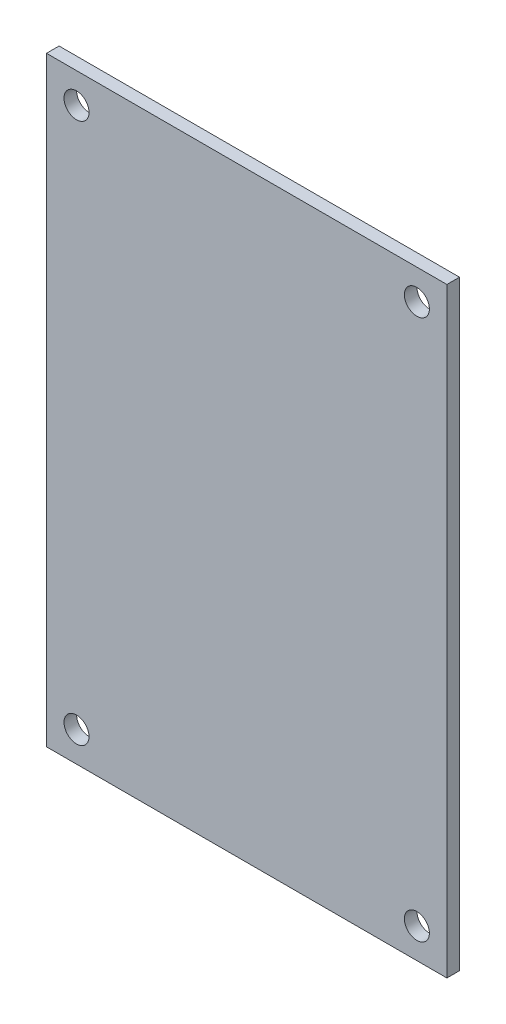
ISO-10303-21;
HEADER;
FILE_DESCRIPTION(('STEP AP214'),'2;1');
FILE_NAME('part.step','',(''),(''),'','','');
FILE_SCHEMA(('AUTOMOTIVE_DESIGN { 1 0 10303 214 1 1 1 1 }'));
ENDSEC;
DATA;
#1=APPLICATION_CONTEXT('core data for automotive mechanical design processes');
#2=APPLICATION_PROTOCOL_DEFINITION('international standard','automotive_design',2000,#1);
#3=PRODUCT_CONTEXT('',#1,'mechanical');
#4=PRODUCT('Part','Part','',(#3));
#5=PRODUCT_RELATED_PRODUCT_CATEGORY('part','',(#4));
#6=PRODUCT_DEFINITION_FORMATION('','',#4);
#7=PRODUCT_DEFINITION_CONTEXT('part definition',#1,'design');
#8=PRODUCT_DEFINITION('design','',#6,#7);
#9=PRODUCT_DEFINITION_SHAPE('','',#8);
#10=(LENGTH_UNIT() NAMED_UNIT(*) SI_UNIT(.MILLI.,.METRE.));
#11=(NAMED_UNIT(*) PLANE_ANGLE_UNIT() SI_UNIT($,.RADIAN.));
#12=(NAMED_UNIT(*) SI_UNIT($,.STERADIAN.) SOLID_ANGLE_UNIT());
#13=UNCERTAINTY_MEASURE_WITH_UNIT(LENGTH_MEASURE(1.E-05),#10,'distance_accuracy_value','');
#14=(GEOMETRIC_REPRESENTATION_CONTEXT(3) GLOBAL_UNCERTAINTY_ASSIGNED_CONTEXT((#13)) GLOBAL_UNIT_ASSIGNED_CONTEXT((#10,
#11,#12)) REPRESENTATION_CONTEXT('',''));
#15=CARTESIAN_POINT('',(0.,0.,0.));
#16=DIRECTION('',(0.,0.,1.));
#17=DIRECTION('',(1.,0.,0.));
#18=AXIS2_PLACEMENT_3D('',#15,#16,#17);
#19=CARTESIAN_POINT('',(-25.4,-38.1,1.6002));
#20=DIRECTION('',(1.,0.,0.));
#21=DIRECTION('',(0.,0.,-1.));
#22=AXIS2_PLACEMENT_3D('',#19,#20,#21);
#23=PLANE('',#22);
#24=DIRECTION('',(0.,-1.,0.));
#25=VECTOR('',#24,1.);
#26=CARTESIAN_POINT('',(-25.4,-38.1,0.));
#27=LINE('',#26,#25);
#28=CARTESIAN_POINT('',(-25.4,38.1,0.));
#29=VERTEX_POINT('',#28);
#30=CARTESIAN_POINT('',(-25.4,-38.1,0.));
#31=VERTEX_POINT('',#30);
#32=EDGE_CURVE('E97',#29,#31,#27,.T.);
#33=ORIENTED_EDGE('',*,*,#32,.T.);
#34=DIRECTION('',(0.,0.,-1.));
#35=VECTOR('',#34,1.);
#36=CARTESIAN_POINT('',(-25.4,-38.1,1.6002));
#37=LINE('',#36,#35);
#38=CARTESIAN_POINT('',(-25.4,-38.1,1.6002));
#39=VERTEX_POINT('',#38);
#40=EDGE_CURVE('E11',#39,#31,#37,.T.);
#41=ORIENTED_EDGE('',*,*,#40,.F.);
#42=DIRECTION('',(0.,-1.,0.));
#43=VECTOR('',#42,1.);
#44=CARTESIAN_POINT('',(-25.4,-38.1,1.6002));
#45=LINE('',#44,#43);
#46=CARTESIAN_POINT('',(-25.4,38.1,1.6002));
#47=VERTEX_POINT('',#46);
#48=EDGE_CURVE('E85',#47,#39,#45,.T.);
#49=ORIENTED_EDGE('',*,*,#48,.F.);
#50=DIRECTION('',(0.,0.,-1.));
#51=VECTOR('',#50,1.);
#52=CARTESIAN_POINT('',(-25.4,38.1,1.6002));
#53=LINE('',#52,#51);
#54=EDGE_CURVE('E93',#47,#29,#53,.T.);
#55=ORIENTED_EDGE('',*,*,#54,.T.);
#56=EDGE_LOOP('',(#33,#41,#49,#55));
#57=FACE_BOUND('',#56,.T.);
#58=ADVANCED_FACE('F34',(#57),#23,.F.);
#59=CARTESIAN_POINT('',(25.4,-38.1,1.6002));
#60=DIRECTION('',(0.,1.,0.));
#61=DIRECTION('',(-1.,0.,0.));
#62=AXIS2_PLACEMENT_3D('',#59,#60,#61);
#63=PLANE('',#62);
#64=DIRECTION('',(1.,0.,0.));
#65=VECTOR('',#64,1.);
#66=CARTESIAN_POINT('',(25.4,-38.1,0.));
#67=LINE('',#66,#65);
#68=CARTESIAN_POINT('',(25.4,-38.1,0.));
#69=VERTEX_POINT('',#68);
#70=EDGE_CURVE('E89',#31,#69,#67,.T.);
#71=ORIENTED_EDGE('',*,*,#70,.T.);
#72=DIRECTION('',(0.,0.,-1.));
#73=VECTOR('',#72,1.);
#74=CARTESIAN_POINT('',(25.4,-38.1,1.6002));
#75=LINE('',#74,#73);
#76=CARTESIAN_POINT('',(25.4,-38.1,1.6002));
#77=VERTEX_POINT('',#76);
#78=EDGE_CURVE('E42',#77,#69,#75,.T.);
#79=ORIENTED_EDGE('',*,*,#78,.F.);
#80=DIRECTION('',(1.,0.,0.));
#81=VECTOR('',#80,1.);
#82=CARTESIAN_POINT('',(25.4,-38.1,1.6002));
#83=LINE('',#82,#81);
#84=EDGE_CURVE('E80',#39,#77,#83,.T.);
#85=ORIENTED_EDGE('',*,*,#84,.F.);
#86=ORIENTED_EDGE('',*,*,#40,.T.);
#87=EDGE_LOOP('',(#71,#79,#85,#86));
#88=FACE_BOUND('',#87,.T.);
#89=ADVANCED_FACE('F88',(#88),#63,.F.);
#90=CARTESIAN_POINT('',(25.4,-38.1,1.6002));
#91=DIRECTION('',(-1.,0.,0.));
#92=DIRECTION('',(0.,0.,1.));
#93=AXIS2_PLACEMENT_3D('',#90,#91,#92);
#94=PLANE('',#93);
#95=DIRECTION('',(0.,1.,0.));
#96=VECTOR('',#95,1.);
#97=CARTESIAN_POINT('',(25.4,-38.1,0.));
#98=LINE('',#97,#96);
#99=CARTESIAN_POINT('',(25.4,38.1,0.));
#100=VERTEX_POINT('',#99);
#101=EDGE_CURVE('E67',#69,#100,#98,.T.);
#102=ORIENTED_EDGE('',*,*,#101,.T.);
#103=DIRECTION('',(0.,0.,-1.));
#104=VECTOR('',#103,1.);
#105=CARTESIAN_POINT('',(25.4,38.1,1.6002));
#106=LINE('',#105,#104);
#107=CARTESIAN_POINT('',(25.4,38.1,1.6002));
#108=VERTEX_POINT('',#107);
#109=EDGE_CURVE('E90',#108,#100,#106,.T.);
#110=ORIENTED_EDGE('',*,*,#109,.F.);
#111=DIRECTION('',(0.,1.,0.));
#112=VECTOR('',#111,1.);
#113=CARTESIAN_POINT('',(25.4,-38.1,1.6002));
#114=LINE('',#113,#112);
#115=EDGE_CURVE('E83',#77,#108,#114,.T.);
#116=ORIENTED_EDGE('',*,*,#115,.F.);
#117=ORIENTED_EDGE('',*,*,#78,.T.);
#118=EDGE_LOOP('',(#102,#110,#116,#117));
#119=FACE_BOUND('',#118,.T.);
#120=ADVANCED_FACE('F91',(#119),#94,.F.);
#121=CARTESIAN_POINT('',(25.4,38.1,1.6002));
#122=DIRECTION('',(0.,-1.,0.));
#123=DIRECTION('',(1.,0.,0.));
#124=AXIS2_PLACEMENT_3D('',#121,#122,#123);
#125=PLANE('',#124);
#126=DIRECTION('',(-1.,0.,0.));
#127=VECTOR('',#126,1.);
#128=CARTESIAN_POINT('',(25.4,38.1,0.));
#129=LINE('',#128,#127);
#130=EDGE_CURVE('E73',#100,#29,#129,.T.);
#131=ORIENTED_EDGE('',*,*,#130,.T.);
#132=ORIENTED_EDGE('',*,*,#54,.F.);
#133=DIRECTION('',(-1.,0.,0.));
#134=VECTOR('',#133,1.);
#135=CARTESIAN_POINT('',(25.4,38.1,1.6002));
#136=LINE('',#135,#134);
#137=EDGE_CURVE('E50',#108,#47,#136,.T.);
#138=ORIENTED_EDGE('',*,*,#137,.F.);
#139=ORIENTED_EDGE('',*,*,#109,.T.);
#140=EDGE_LOOP('',(#131,#132,#138,#139));
#141=FACE_BOUND('',#140,.T.);
#142=ADVANCED_FACE('F105',(#141),#125,.F.);
#143=CARTESIAN_POINT('',(0.,0.,1.6002));
#144=DIRECTION('',(0.,0.,1.));
#145=DIRECTION('',(1.,0.,0.));
#146=AXIS2_PLACEMENT_3D('',#143,#144,#145);
#147=PLANE('',#146);
#148=CARTESIAN_POINT('',(-21.59,-34.29,1.6002));
#149=DIRECTION('',(0.,0.,1.));
#150=DIRECTION('',(-1.,0.,0.));
#151=AXIS2_PLACEMENT_3D('',#148,#149,#150);
#152=CIRCLE('',#151,1.5875);
#153=CARTESIAN_POINT('',(-20.0025,-34.29,1.6002));
#154=VERTEX_POINT('',#153);
#155=EDGE_CURVE('E121',#154,#154,#152,.T.);
#156=ORIENTED_EDGE('',*,*,#155,.F.);
#157=EDGE_LOOP('',(#156));
#158=FACE_BOUND('',#157,.T.);
#159=CARTESIAN_POINT('',(21.59,-34.29,1.6002));
#160=DIRECTION('',(0.,0.,1.));
#161=DIRECTION('',(1.,0.,0.));
#162=AXIS2_PLACEMENT_3D('',#159,#160,#161);
#163=CIRCLE('',#162,1.5875);
#164=CARTESIAN_POINT('',(23.1775,-34.29,1.6002));
#165=VERTEX_POINT('',#164);
#166=EDGE_CURVE('E120',#165,#165,#163,.T.);
#167=ORIENTED_EDGE('',*,*,#166,.F.);
#168=EDGE_LOOP('',(#167));
#169=FACE_BOUND('',#168,.T.);
#170=CARTESIAN_POINT('',(21.59,34.29,1.6002));
#171=DIRECTION('',(0.,0.,1.));
#172=DIRECTION('',(-1.,0.,0.));
#173=AXIS2_PLACEMENT_3D('',#170,#171,#172);
#174=CIRCLE('',#173,1.5875);
#175=CARTESIAN_POINT('',(23.1775,34.29,1.6002));
#176=VERTEX_POINT('',#175);
#177=EDGE_CURVE('E127',#176,#176,#174,.T.);
#178=ORIENTED_EDGE('',*,*,#177,.F.);
#179=EDGE_LOOP('',(#178));
#180=FACE_BOUND('',#179,.T.);
#181=CARTESIAN_POINT('',(-21.59,34.29,1.6002));
#182=DIRECTION('',(0.,0.,1.));
#183=DIRECTION('',(1.,0.,0.));
#184=AXIS2_PLACEMENT_3D('',#181,#182,#183);
#185=CIRCLE('',#184,1.5875);
#186=CARTESIAN_POINT('',(-20.0025,34.29,1.6002));
#187=VERTEX_POINT('',#186);
#188=EDGE_CURVE('E113',#187,#187,#185,.T.);
#189=ORIENTED_EDGE('',*,*,#188,.F.);
#190=EDGE_LOOP('',(#189));
#191=FACE_BOUND('',#190,.T.);
#192=ORIENTED_EDGE('',*,*,#48,.T.);
#193=ORIENTED_EDGE('',*,*,#84,.T.);
#194=ORIENTED_EDGE('',*,*,#115,.T.);
#195=ORIENTED_EDGE('',*,*,#137,.T.);
#196=EDGE_LOOP('',(#192,#193,#194,#195));
#197=FACE_BOUND('',#196,.T.);
#198=ADVANCED_FACE('F81',(#158,#169,#180,#191,#197),#147,.T.);
#199=CARTESIAN_POINT('',(0.,0.,0.));
#200=DIRECTION('',(0.,0.,1.));
#201=DIRECTION('',(1.,0.,0.));
#202=AXIS2_PLACEMENT_3D('',#199,#200,#201);
#203=PLANE('',#202);
#204=CARTESIAN_POINT('',(-21.59,-34.29,0.));
#205=DIRECTION('',(0.,0.,1.));
#206=DIRECTION('',(1.,0.,0.));
#207=AXIS2_PLACEMENT_3D('',#204,#205,#206);
#208=CIRCLE('',#207,1.5875);
#209=CARTESIAN_POINT('',(-20.0025,-34.29,0.));
#210=VERTEX_POINT('',#209);
#211=EDGE_CURVE('E117',#210,#210,#208,.F.);
#212=ORIENTED_EDGE('',*,*,#211,.F.);
#213=EDGE_LOOP('',(#212));
#214=FACE_BOUND('',#213,.T.);
#215=CARTESIAN_POINT('',(21.59,-34.29,0.));
#216=DIRECTION('',(0.,0.,1.));
#217=DIRECTION('',(1.,0.,0.));
#218=AXIS2_PLACEMENT_3D('',#215,#216,#217);
#219=CIRCLE('',#218,1.5875);
#220=CARTESIAN_POINT('',(23.1775,-34.29,0.));
#221=VERTEX_POINT('',#220);
#222=EDGE_CURVE('E124',#221,#221,#219,.F.);
#223=ORIENTED_EDGE('',*,*,#222,.F.);
#224=EDGE_LOOP('',(#223));
#225=FACE_BOUND('',#224,.T.);
#226=CARTESIAN_POINT('',(21.59,34.29,0.));
#227=DIRECTION('',(0.,0.,1.));
#228=DIRECTION('',(1.,0.,0.));
#229=AXIS2_PLACEMENT_3D('',#226,#227,#228);
#230=CIRCLE('',#229,1.5875);
#231=CARTESIAN_POINT('',(23.1775,34.29,0.));
#232=VERTEX_POINT('',#231);
#233=EDGE_CURVE('E116',#232,#232,#230,.F.);
#234=ORIENTED_EDGE('',*,*,#233,.F.);
#235=EDGE_LOOP('',(#234));
#236=FACE_BOUND('',#235,.T.);
#237=CARTESIAN_POINT('',(-21.59,34.29,0.));
#238=DIRECTION('',(0.,0.,1.));
#239=DIRECTION('',(1.,0.,0.));
#240=AXIS2_PLACEMENT_3D('',#237,#238,#239);
#241=CIRCLE('',#240,1.5875);
#242=CARTESIAN_POINT('',(-20.0025,34.29,0.));
#243=VERTEX_POINT('',#242);
#244=EDGE_CURVE('E100',#243,#243,#241,.F.);
#245=ORIENTED_EDGE('',*,*,#244,.F.);
#246=EDGE_LOOP('',(#245));
#247=FACE_BOUND('',#246,.T.);
#248=ORIENTED_EDGE('',*,*,#32,.F.);
#249=ORIENTED_EDGE('',*,*,#130,.F.);
#250=ORIENTED_EDGE('',*,*,#101,.F.);
#251=ORIENTED_EDGE('',*,*,#70,.F.);
#252=EDGE_LOOP('',(#248,#249,#250,#251));
#253=FACE_BOUND('',#252,.T.);
#254=ADVANCED_FACE('F108',(#214,#225,#236,#247,#253),#203,.F.);
#255=CARTESIAN_POINT('',(-21.59,34.29,-0.000999999999999916));
#256=DIRECTION('',(0.,0.,1.));
#257=DIRECTION('',(1.,0.,0.));
#258=AXIS2_PLACEMENT_3D('',#255,#256,#257);
#259=CYLINDRICAL_SURFACE('',#258,1.5875);
#260=CARTESIAN_POINT('',(-20.0025,34.29,1.6002));
#261=CARTESIAN_POINT('',(-20.0025,34.29,1.58353125));
#262=CARTESIAN_POINT('',(-20.0025,34.29,1.5668625));
#263=CARTESIAN_POINT('',(-20.0025,34.29,1.533525));
#264=CARTESIAN_POINT('',(-20.0025,34.29,1.51685625));
#265=CARTESIAN_POINT('',(-20.0025,34.29,1.48351875));
#266=CARTESIAN_POINT('',(-20.0025,34.29,1.46685));
#267=CARTESIAN_POINT('',(-20.0025,34.29,1.4335125));
#268=CARTESIAN_POINT('',(-20.0025,34.29,1.41684375));
#269=CARTESIAN_POINT('',(-20.0025,34.29,1.38350625));
#270=CARTESIAN_POINT('',(-20.0025,34.29,1.3668375));
#271=CARTESIAN_POINT('',(-20.0025,34.29,1.3335));
#272=CARTESIAN_POINT('',(-20.0025,34.29,1.31683125));
#273=CARTESIAN_POINT('',(-20.0025,34.29,1.28349375));
#274=CARTESIAN_POINT('',(-20.0025,34.29,1.266825));
#275=CARTESIAN_POINT('',(-20.0025,34.29,1.2334875));
#276=CARTESIAN_POINT('',(-20.0025,34.29,1.21681875));
#277=CARTESIAN_POINT('',(-20.0025,34.29,1.18348125));
#278=CARTESIAN_POINT('',(-20.0025,34.29,1.1668125));
#279=CARTESIAN_POINT('',(-20.0025,34.29,1.133475));
#280=CARTESIAN_POINT('',(-20.0025,34.29,1.11680625));
#281=CARTESIAN_POINT('',(-20.0025,34.29,1.08346875));
#282=CARTESIAN_POINT('',(-20.0025,34.29,1.0668));
#283=CARTESIAN_POINT('',(-20.0025,34.29,1.0334625));
#284=CARTESIAN_POINT('',(-20.0025,34.29,1.01679375));
#285=CARTESIAN_POINT('',(-20.0025,34.29,0.98345625));
#286=CARTESIAN_POINT('',(-20.0025,34.29,0.9667875));
#287=CARTESIAN_POINT('',(-20.0025,34.29,0.93345));
#288=CARTESIAN_POINT('',(-20.0025,34.29,0.91678125));
#289=CARTESIAN_POINT('',(-20.0025,34.29,0.88344375));
#290=CARTESIAN_POINT('',(-20.0025,34.29,0.866775));
#291=CARTESIAN_POINT('',(-20.0025,34.29,0.8334375));
#292=CARTESIAN_POINT('',(-20.0025,34.29,0.81676875));
#293=CARTESIAN_POINT('',(-20.0025,34.29,0.78343125));
#294=CARTESIAN_POINT('',(-20.0025,34.29,0.7667625));
#295=CARTESIAN_POINT('',(-20.0025,34.29,0.733425));
#296=CARTESIAN_POINT('',(-20.0025,34.29,0.71675625));
#297=CARTESIAN_POINT('',(-20.0025,34.29,0.68341875));
#298=CARTESIAN_POINT('',(-20.0025,34.29,0.66675));
#299=CARTESIAN_POINT('',(-20.0025,34.29,0.6334125));
#300=CARTESIAN_POINT('',(-20.0025,34.29,0.61674375));
#301=CARTESIAN_POINT('',(-20.0025,34.29,0.58340625));
#302=CARTESIAN_POINT('',(-20.0025,34.29,0.5667375));
#303=CARTESIAN_POINT('',(-20.0025,34.29,0.5334));
#304=CARTESIAN_POINT('',(-20.0025,34.29,0.51673125));
#305=CARTESIAN_POINT('',(-20.0025,34.29,0.48339375));
#306=CARTESIAN_POINT('',(-20.0025,34.29,0.466725));
#307=CARTESIAN_POINT('',(-20.0025,34.29,0.4333875));
#308=CARTESIAN_POINT('',(-20.0025,34.29,0.41671875));
#309=CARTESIAN_POINT('',(-20.0025,34.29,0.38338125));
#310=CARTESIAN_POINT('',(-20.0025,34.29,0.3667125));
#311=CARTESIAN_POINT('',(-20.0025,34.29,0.333375));
#312=CARTESIAN_POINT('',(-20.0025,34.29,0.31670625));
#313=CARTESIAN_POINT('',(-20.0025,34.29,0.28336875));
#314=CARTESIAN_POINT('',(-20.0025,34.29,0.2667));
#315=CARTESIAN_POINT('',(-20.0025,34.29,0.2333625));
#316=CARTESIAN_POINT('',(-20.0025,34.29,0.21669375));
#317=CARTESIAN_POINT('',(-20.0025,34.29,0.18335625));
#318=CARTESIAN_POINT('',(-20.0025,34.29,0.1666875));
#319=CARTESIAN_POINT('',(-20.0025,34.29,0.13335));
#320=CARTESIAN_POINT('',(-20.0025,34.29,0.11668125));
#321=CARTESIAN_POINT('',(-20.0025,34.29,0.08334375));
#322=CARTESIAN_POINT('',(-20.0025,34.29,0.066675));
#323=CARTESIAN_POINT('',(-20.0025,34.29,0.0333375000000001));
#324=CARTESIAN_POINT('',(-20.0025,34.29,0.01666875));
#325=CARTESIAN_POINT('',(-20.0025,34.29,0.));
#326=B_SPLINE_CURVE_WITH_KNOTS('',3,(#260,#261,#262,#263,#264,#265,#266,#267,#268,#269,#270,
#271,#272,#273,#274,#275,#276,#277,#278,#279,#280,#281,#282,#283,#284,#285,#286,#287,#288,#289,
#290,#291,#292,#293,#294,#295,#296,#297,#298,#299,#300,#301,#302,#303,#304,#305,#306,#307,#308,
#309,#310,#311,#312,#313,#314,#315,#316,#317,#318,#319,#320,#321,#322,#323,#324,#325),
.UNSPECIFIED.,.F.,.F.,(4,2,2,2,2,2,2,2,2,2,2,2,2,2,2,2,2,2,2,2,2,2,2,2,2,2,2,2,2,2,2,2,4),(0.,
0.0500062500000001,0.1000125,0.15001875,0.200025,0.25003125,0.3000375,0.35004375,0.40005,
0.45005625,0.5000625,0.55006875,0.600075,0.65008125,0.7000875,0.75009375,0.8001,0.85010625,
0.9001125,0.95011875,1.000125,1.05013125,1.1001375,1.15014375,1.20015,1.25015625,1.3001625,
1.35016875,1.400175,1.45018125,1.5001875,1.55019375,1.6002),.UNSPECIFIED.);
#327=EDGE_CURVE('BSEAM144',#187,#243,#326,.T.);
#328=ORIENTED_EDGE('',*,*,#188,.T.);
#329=ORIENTED_EDGE('',*,*,#244,.T.);
#330=ORIENTED_EDGE('',*,*,#327,.T.);
#331=ORIENTED_EDGE('',*,*,#327,.F.);
#332=EDGE_LOOP('',(#328,#330,#329,#331));
#333=FACE_BOUND('',#332,.T.);
#334=ADVANCED_FACE('F144',(#333),#259,.F.);
#335=CARTESIAN_POINT('',(21.59,34.29,-0.000999999999999916));
#336=DIRECTION('',(0.,0.,1.));
#337=DIRECTION('',(1.,0.,0.));
#338=AXIS2_PLACEMENT_3D('',#335,#336,#337);
#339=CYLINDRICAL_SURFACE('',#338,1.5875);
#340=CARTESIAN_POINT('',(23.1775,34.29,1.6002));
#341=CARTESIAN_POINT('',(23.1775,34.29,1.58353125));
#342=CARTESIAN_POINT('',(23.1775,34.29,1.5668625));
#343=CARTESIAN_POINT('',(23.1775,34.29,1.533525));
#344=CARTESIAN_POINT('',(23.1775,34.29,1.51685625));
#345=CARTESIAN_POINT('',(23.1775,34.29,1.48351875));
#346=CARTESIAN_POINT('',(23.1775,34.29,1.46685));
#347=CARTESIAN_POINT('',(23.1775,34.29,1.4335125));
#348=CARTESIAN_POINT('',(23.1775,34.29,1.41684375));
#349=CARTESIAN_POINT('',(23.1775,34.29,1.38350625));
#350=CARTESIAN_POINT('',(23.1775,34.29,1.3668375));
#351=CARTESIAN_POINT('',(23.1775,34.29,1.3335));
#352=CARTESIAN_POINT('',(23.1775,34.29,1.31683125));
#353=CARTESIAN_POINT('',(23.1775,34.29,1.28349375));
#354=CARTESIAN_POINT('',(23.1775,34.29,1.266825));
#355=CARTESIAN_POINT('',(23.1775,34.29,1.2334875));
#356=CARTESIAN_POINT('',(23.1775,34.29,1.21681875));
#357=CARTESIAN_POINT('',(23.1775,34.29,1.18348125));
#358=CARTESIAN_POINT('',(23.1775,34.29,1.1668125));
#359=CARTESIAN_POINT('',(23.1775,34.29,1.133475));
#360=CARTESIAN_POINT('',(23.1775,34.29,1.11680625));
#361=CARTESIAN_POINT('',(23.1775,34.29,1.08346875));
#362=CARTESIAN_POINT('',(23.1775,34.29,1.0668));
#363=CARTESIAN_POINT('',(23.1775,34.29,1.0334625));
#364=CARTESIAN_POINT('',(23.1775,34.29,1.01679375));
#365=CARTESIAN_POINT('',(23.1775,34.29,0.98345625));
#366=CARTESIAN_POINT('',(23.1775,34.29,0.9667875));
#367=CARTESIAN_POINT('',(23.1775,34.29,0.93345));
#368=CARTESIAN_POINT('',(23.1775,34.29,0.91678125));
#369=CARTESIAN_POINT('',(23.1775,34.29,0.88344375));
#370=CARTESIAN_POINT('',(23.1775,34.29,0.866775));
#371=CARTESIAN_POINT('',(23.1775,34.29,0.8334375));
#372=CARTESIAN_POINT('',(23.1775,34.29,0.81676875));
#373=CARTESIAN_POINT('',(23.1775,34.29,0.78343125));
#374=CARTESIAN_POINT('',(23.1775,34.29,0.7667625));
#375=CARTESIAN_POINT('',(23.1775,34.29,0.733425));
#376=CARTESIAN_POINT('',(23.1775,34.29,0.71675625));
#377=CARTESIAN_POINT('',(23.1775,34.29,0.68341875));
#378=CARTESIAN_POINT('',(23.1775,34.29,0.66675));
#379=CARTESIAN_POINT('',(23.1775,34.29,0.6334125));
#380=CARTESIAN_POINT('',(23.1775,34.29,0.61674375));
#381=CARTESIAN_POINT('',(23.1775,34.29,0.58340625));
#382=CARTESIAN_POINT('',(23.1775,34.29,0.5667375));
#383=CARTESIAN_POINT('',(23.1775,34.29,0.5334));
#384=CARTESIAN_POINT('',(23.1775,34.29,0.51673125));
#385=CARTESIAN_POINT('',(23.1775,34.29,0.48339375));
#386=CARTESIAN_POINT('',(23.1775,34.29,0.466725));
#387=CARTESIAN_POINT('',(23.1775,34.29,0.4333875));
#388=CARTESIAN_POINT('',(23.1775,34.29,0.41671875));
#389=CARTESIAN_POINT('',(23.1775,34.29,0.38338125));
#390=CARTESIAN_POINT('',(23.1775,34.29,0.3667125));
#391=CARTESIAN_POINT('',(23.1775,34.29,0.333375));
#392=CARTESIAN_POINT('',(23.1775,34.29,0.31670625));
#393=CARTESIAN_POINT('',(23.1775,34.29,0.28336875));
#394=CARTESIAN_POINT('',(23.1775,34.29,0.2667));
#395=CARTESIAN_POINT('',(23.1775,34.29,0.2333625));
#396=CARTESIAN_POINT('',(23.1775,34.29,0.21669375));
#397=CARTESIAN_POINT('',(23.1775,34.29,0.18335625));
#398=CARTESIAN_POINT('',(23.1775,34.29,0.1666875));
#399=CARTESIAN_POINT('',(23.1775,34.29,0.13335));
#400=CARTESIAN_POINT('',(23.1775,34.29,0.11668125));
#401=CARTESIAN_POINT('',(23.1775,34.29,0.08334375));
#402=CARTESIAN_POINT('',(23.1775,34.29,0.066675));
#403=CARTESIAN_POINT('',(23.1775,34.29,0.0333375000000001));
#404=CARTESIAN_POINT('',(23.1775,34.29,0.01666875));
#405=CARTESIAN_POINT('',(23.1775,34.29,0.));
#406=B_SPLINE_CURVE_WITH_KNOTS('',3,(#340,#341,#342,#343,#344,#345,#346,#347,#348,#349,#350,
#351,#352,#353,#354,#355,#356,#357,#358,#359,#360,#361,#362,#363,#364,#365,#366,#367,#368,#369,
#370,#371,#372,#373,#374,#375,#376,#377,#378,#379,#380,#381,#382,#383,#384,#385,#386,#387,#388,
#389,#390,#391,#392,#393,#394,#395,#396,#397,#398,#399,#400,#401,#402,#403,#404,#405),
.UNSPECIFIED.,.F.,.F.,(4,2,2,2,2,2,2,2,2,2,2,2,2,2,2,2,2,2,2,2,2,2,2,2,2,2,2,2,2,2,2,2,4),(0.,
0.0500062500000001,0.1000125,0.15001875,0.200025,0.25003125,0.3000375,0.35004375,0.40005,
0.45005625,0.5000625,0.55006875,0.600075,0.65008125,0.7000875,0.75009375,0.8001,0.85010625,
0.9001125,0.95011875,1.000125,1.05013125,1.1001375,1.15014375,1.20015,1.25015625,1.3001625,
1.35016875,1.400175,1.45018125,1.5001875,1.55019375,1.6002),.UNSPECIFIED.);
#407=EDGE_CURVE('BSEAM135',#176,#232,#406,.T.);
#408=ORIENTED_EDGE('',*,*,#177,.T.);
#409=ORIENTED_EDGE('',*,*,#233,.T.);
#410=ORIENTED_EDGE('',*,*,#407,.T.);
#411=ORIENTED_EDGE('',*,*,#407,.F.);
#412=EDGE_LOOP('',(#408,#410,#409,#411));
#413=FACE_BOUND('',#412,.T.);
#414=ADVANCED_FACE('F135',(#413),#339,.F.);
#415=CARTESIAN_POINT('',(21.59,-34.29,-0.000999999999999916));
#416=DIRECTION('',(0.,0.,1.));
#417=DIRECTION('',(1.,0.,0.));
#418=AXIS2_PLACEMENT_3D('',#415,#416,#417);
#419=CYLINDRICAL_SURFACE('',#418,1.5875);
#420=CARTESIAN_POINT('',(23.1775,-34.29,1.6002));
#421=CARTESIAN_POINT('',(23.1775,-34.29,1.58353125));
#422=CARTESIAN_POINT('',(23.1775,-34.29,1.5668625));
#423=CARTESIAN_POINT('',(23.1775,-34.29,1.533525));
#424=CARTESIAN_POINT('',(23.1775,-34.29,1.51685625));
#425=CARTESIAN_POINT('',(23.1775,-34.29,1.48351875));
#426=CARTESIAN_POINT('',(23.1775,-34.29,1.46685));
#427=CARTESIAN_POINT('',(23.1775,-34.29,1.4335125));
#428=CARTESIAN_POINT('',(23.1775,-34.29,1.41684375));
#429=CARTESIAN_POINT('',(23.1775,-34.29,1.38350625));
#430=CARTESIAN_POINT('',(23.1775,-34.29,1.3668375));
#431=CARTESIAN_POINT('',(23.1775,-34.29,1.3335));
#432=CARTESIAN_POINT('',(23.1775,-34.29,1.31683125));
#433=CARTESIAN_POINT('',(23.1775,-34.29,1.28349375));
#434=CARTESIAN_POINT('',(23.1775,-34.29,1.266825));
#435=CARTESIAN_POINT('',(23.1775,-34.29,1.2334875));
#436=CARTESIAN_POINT('',(23.1775,-34.29,1.21681875));
#437=CARTESIAN_POINT('',(23.1775,-34.29,1.18348125));
#438=CARTESIAN_POINT('',(23.1775,-34.29,1.1668125));
#439=CARTESIAN_POINT('',(23.1775,-34.29,1.133475));
#440=CARTESIAN_POINT('',(23.1775,-34.29,1.11680625));
#441=CARTESIAN_POINT('',(23.1775,-34.29,1.08346875));
#442=CARTESIAN_POINT('',(23.1775,-34.29,1.0668));
#443=CARTESIAN_POINT('',(23.1775,-34.29,1.0334625));
#444=CARTESIAN_POINT('',(23.1775,-34.29,1.01679375));
#445=CARTESIAN_POINT('',(23.1775,-34.29,0.98345625));
#446=CARTESIAN_POINT('',(23.1775,-34.29,0.9667875));
#447=CARTESIAN_POINT('',(23.1775,-34.29,0.93345));
#448=CARTESIAN_POINT('',(23.1775,-34.29,0.91678125));
#449=CARTESIAN_POINT('',(23.1775,-34.29,0.88344375));
#450=CARTESIAN_POINT('',(23.1775,-34.29,0.866775));
#451=CARTESIAN_POINT('',(23.1775,-34.29,0.8334375));
#452=CARTESIAN_POINT('',(23.1775,-34.29,0.81676875));
#453=CARTESIAN_POINT('',(23.1775,-34.29,0.78343125));
#454=CARTESIAN_POINT('',(23.1775,-34.29,0.7667625));
#455=CARTESIAN_POINT('',(23.1775,-34.29,0.733425));
#456=CARTESIAN_POINT('',(23.1775,-34.29,0.71675625));
#457=CARTESIAN_POINT('',(23.1775,-34.29,0.68341875));
#458=CARTESIAN_POINT('',(23.1775,-34.29,0.66675));
#459=CARTESIAN_POINT('',(23.1775,-34.29,0.6334125));
#460=CARTESIAN_POINT('',(23.1775,-34.29,0.61674375));
#461=CARTESIAN_POINT('',(23.1775,-34.29,0.58340625));
#462=CARTESIAN_POINT('',(23.1775,-34.29,0.5667375));
#463=CARTESIAN_POINT('',(23.1775,-34.29,0.5334));
#464=CARTESIAN_POINT('',(23.1775,-34.29,0.51673125));
#465=CARTESIAN_POINT('',(23.1775,-34.29,0.48339375));
#466=CARTESIAN_POINT('',(23.1775,-34.29,0.466725));
#467=CARTESIAN_POINT('',(23.1775,-34.29,0.4333875));
#468=CARTESIAN_POINT('',(23.1775,-34.29,0.41671875));
#469=CARTESIAN_POINT('',(23.1775,-34.29,0.38338125));
#470=CARTESIAN_POINT('',(23.1775,-34.29,0.3667125));
#471=CARTESIAN_POINT('',(23.1775,-34.29,0.333375));
#472=CARTESIAN_POINT('',(23.1775,-34.29,0.31670625));
#473=CARTESIAN_POINT('',(23.1775,-34.29,0.28336875));
#474=CARTESIAN_POINT('',(23.1775,-34.29,0.2667));
#475=CARTESIAN_POINT('',(23.1775,-34.29,0.2333625));
#476=CARTESIAN_POINT('',(23.1775,-34.29,0.21669375));
#477=CARTESIAN_POINT('',(23.1775,-34.29,0.18335625));
#478=CARTESIAN_POINT('',(23.1775,-34.29,0.1666875));
#479=CARTESIAN_POINT('',(23.1775,-34.29,0.13335));
#480=CARTESIAN_POINT('',(23.1775,-34.29,0.11668125));
#481=CARTESIAN_POINT('',(23.1775,-34.29,0.08334375));
#482=CARTESIAN_POINT('',(23.1775,-34.29,0.066675));
#483=CARTESIAN_POINT('',(23.1775,-34.29,0.0333375000000001));
#484=CARTESIAN_POINT('',(23.1775,-34.29,0.01666875));
#485=CARTESIAN_POINT('',(23.1775,-34.29,0.));
#486=B_SPLINE_CURVE_WITH_KNOTS('',3,(#420,#421,#422,#423,#424,#425,#426,#427,#428,#429,#430,
#431,#432,#433,#434,#435,#436,#437,#438,#439,#440,#441,#442,#443,#444,#445,#446,#447,#448,#449,
#450,#451,#452,#453,#454,#455,#456,#457,#458,#459,#460,#461,#462,#463,#464,#465,#466,#467,#468,
#469,#470,#471,#472,#473,#474,#475,#476,#477,#478,#479,#480,#481,#482,#483,#484,#485),
.UNSPECIFIED.,.F.,.F.,(4,2,2,2,2,2,2,2,2,2,2,2,2,2,2,2,2,2,2,2,2,2,2,2,2,2,2,2,2,2,2,2,4),(0.,
0.0500062500000001,0.1000125,0.15001875,0.200025,0.25003125,0.3000375,0.35004375,0.40005,
0.45005625,0.5000625,0.55006875,0.600075,0.65008125,0.7000875,0.75009375,0.8001,0.85010625,
0.9001125,0.95011875,1.000125,1.05013125,1.1001375,1.15014375,1.20015,1.25015625,1.3001625,
1.35016875,1.400175,1.45018125,1.5001875,1.55019375,1.6002),.UNSPECIFIED.);
#487=EDGE_CURVE('BSEAM194',#165,#221,#486,.T.);
#488=ORIENTED_EDGE('',*,*,#166,.T.);
#489=ORIENTED_EDGE('',*,*,#222,.T.);
#490=ORIENTED_EDGE('',*,*,#487,.T.);
#491=ORIENTED_EDGE('',*,*,#487,.F.);
#492=EDGE_LOOP('',(#488,#490,#489,#491));
#493=FACE_BOUND('',#492,.T.);
#494=ADVANCED_FACE('F194',(#493),#419,.F.);
#495=CARTESIAN_POINT('',(-21.59,-34.29,-0.000999999999999916));
#496=DIRECTION('',(0.,0.,1.));
#497=DIRECTION('',(1.,0.,0.));
#498=AXIS2_PLACEMENT_3D('',#495,#496,#497);
#499=CYLINDRICAL_SURFACE('',#498,1.5875);
#500=CARTESIAN_POINT('',(-20.0025,-34.29,1.6002));
#501=CARTESIAN_POINT('',(-20.0025,-34.29,1.58353125));
#502=CARTESIAN_POINT('',(-20.0025,-34.29,1.5668625));
#503=CARTESIAN_POINT('',(-20.0025,-34.29,1.533525));
#504=CARTESIAN_POINT('',(-20.0025,-34.29,1.51685625));
#505=CARTESIAN_POINT('',(-20.0025,-34.29,1.48351875));
#506=CARTESIAN_POINT('',(-20.0025,-34.29,1.46685));
#507=CARTESIAN_POINT('',(-20.0025,-34.29,1.4335125));
#508=CARTESIAN_POINT('',(-20.0025,-34.29,1.41684375));
#509=CARTESIAN_POINT('',(-20.0025,-34.29,1.38350625));
#510=CARTESIAN_POINT('',(-20.0025,-34.29,1.3668375));
#511=CARTESIAN_POINT('',(-20.0025,-34.29,1.3335));
#512=CARTESIAN_POINT('',(-20.0025,-34.29,1.31683125));
#513=CARTESIAN_POINT('',(-20.0025,-34.29,1.28349375));
#514=CARTESIAN_POINT('',(-20.0025,-34.29,1.266825));
#515=CARTESIAN_POINT('',(-20.0025,-34.29,1.2334875));
#516=CARTESIAN_POINT('',(-20.0025,-34.29,1.21681875));
#517=CARTESIAN_POINT('',(-20.0025,-34.29,1.18348125));
#518=CARTESIAN_POINT('',(-20.0025,-34.29,1.1668125));
#519=CARTESIAN_POINT('',(-20.0025,-34.29,1.133475));
#520=CARTESIAN_POINT('',(-20.0025,-34.29,1.11680625));
#521=CARTESIAN_POINT('',(-20.0025,-34.29,1.08346875));
#522=CARTESIAN_POINT('',(-20.0025,-34.29,1.0668));
#523=CARTESIAN_POINT('',(-20.0025,-34.29,1.0334625));
#524=CARTESIAN_POINT('',(-20.0025,-34.29,1.01679375));
#525=CARTESIAN_POINT('',(-20.0025,-34.29,0.98345625));
#526=CARTESIAN_POINT('',(-20.0025,-34.29,0.9667875));
#527=CARTESIAN_POINT('',(-20.0025,-34.29,0.93345));
#528=CARTESIAN_POINT('',(-20.0025,-34.29,0.91678125));
#529=CARTESIAN_POINT('',(-20.0025,-34.29,0.88344375));
#530=CARTESIAN_POINT('',(-20.0025,-34.29,0.866775));
#531=CARTESIAN_POINT('',(-20.0025,-34.29,0.8334375));
#532=CARTESIAN_POINT('',(-20.0025,-34.29,0.81676875));
#533=CARTESIAN_POINT('',(-20.0025,-34.29,0.78343125));
#534=CARTESIAN_POINT('',(-20.0025,-34.29,0.7667625));
#535=CARTESIAN_POINT('',(-20.0025,-34.29,0.733425));
#536=CARTESIAN_POINT('',(-20.0025,-34.29,0.71675625));
#537=CARTESIAN_POINT('',(-20.0025,-34.29,0.68341875));
#538=CARTESIAN_POINT('',(-20.0025,-34.29,0.66675));
#539=CARTESIAN_POINT('',(-20.0025,-34.29,0.6334125));
#540=CARTESIAN_POINT('',(-20.0025,-34.29,0.61674375));
#541=CARTESIAN_POINT('',(-20.0025,-34.29,0.58340625));
#542=CARTESIAN_POINT('',(-20.0025,-34.29,0.5667375));
#543=CARTESIAN_POINT('',(-20.0025,-34.29,0.5334));
#544=CARTESIAN_POINT('',(-20.0025,-34.29,0.51673125));
#545=CARTESIAN_POINT('',(-20.0025,-34.29,0.48339375));
#546=CARTESIAN_POINT('',(-20.0025,-34.29,0.466725));
#547=CARTESIAN_POINT('',(-20.0025,-34.29,0.4333875));
#548=CARTESIAN_POINT('',(-20.0025,-34.29,0.41671875));
#549=CARTESIAN_POINT('',(-20.0025,-34.29,0.38338125));
#550=CARTESIAN_POINT('',(-20.0025,-34.29,0.3667125));
#551=CARTESIAN_POINT('',(-20.0025,-34.29,0.333375));
#552=CARTESIAN_POINT('',(-20.0025,-34.29,0.31670625));
#553=CARTESIAN_POINT('',(-20.0025,-34.29,0.28336875));
#554=CARTESIAN_POINT('',(-20.0025,-34.29,0.2667));
#555=CARTESIAN_POINT('',(-20.0025,-34.29,0.2333625));
#556=CARTESIAN_POINT('',(-20.0025,-34.29,0.21669375));
#557=CARTESIAN_POINT('',(-20.0025,-34.29,0.18335625));
#558=CARTESIAN_POINT('',(-20.0025,-34.29,0.1666875));
#559=CARTESIAN_POINT('',(-20.0025,-34.29,0.13335));
#560=CARTESIAN_POINT('',(-20.0025,-34.29,0.11668125));
#561=CARTESIAN_POINT('',(-20.0025,-34.29,0.08334375));
#562=CARTESIAN_POINT('',(-20.0025,-34.29,0.066675));
#563=CARTESIAN_POINT('',(-20.0025,-34.29,0.0333375000000001));
#564=CARTESIAN_POINT('',(-20.0025,-34.29,0.01666875));
#565=CARTESIAN_POINT('',(-20.0025,-34.29,0.));
#566=B_SPLINE_CURVE_WITH_KNOTS('',3,(#500,#501,#502,#503,#504,#505,#506,#507,#508,#509,#510,
#511,#512,#513,#514,#515,#516,#517,#518,#519,#520,#521,#522,#523,#524,#525,#526,#527,#528,#529,
#530,#531,#532,#533,#534,#535,#536,#537,#538,#539,#540,#541,#542,#543,#544,#545,#546,#547,#548,
#549,#550,#551,#552,#553,#554,#555,#556,#557,#558,#559,#560,#561,#562,#563,#564,#565),
.UNSPECIFIED.,.F.,.F.,(4,2,2,2,2,2,2,2,2,2,2,2,2,2,2,2,2,2,2,2,2,2,2,2,2,2,2,2,2,2,2,2,4),(0.,
0.0500062500000001,0.1000125,0.15001875,0.200025,0.25003125,0.3000375,0.35004375,0.40005,
0.45005625,0.5000625,0.55006875,0.600075,0.65008125,0.7000875,0.75009375,0.8001,0.85010625,
0.9001125,0.95011875,1.000125,1.05013125,1.1001375,1.15014375,1.20015,1.25015625,1.3001625,
1.35016875,1.400175,1.45018125,1.5001875,1.55019375,1.6002),.UNSPECIFIED.);
#567=EDGE_CURVE('BSEAM203',#154,#210,#566,.T.);
#568=ORIENTED_EDGE('',*,*,#155,.T.);
#569=ORIENTED_EDGE('',*,*,#211,.T.);
#570=ORIENTED_EDGE('',*,*,#567,.T.);
#571=ORIENTED_EDGE('',*,*,#567,.F.);
#572=EDGE_LOOP('',(#568,#570,#569,#571));
#573=FACE_BOUND('',#572,.T.);
#574=ADVANCED_FACE('F203',(#573),#499,.F.);
#575=CLOSED_SHELL('',(#58,#89,#120,#142,#198,#254,#334,#414,#494,#574));
#576=MANIFOLD_SOLID_BREP('B2',#575);
#577=ADVANCED_BREP_SHAPE_REPRESENTATION('',(#18,#576),#14);
#578=SHAPE_DEFINITION_REPRESENTATION(#9,#577);
ENDSEC;
END-ISO-10303-21;
